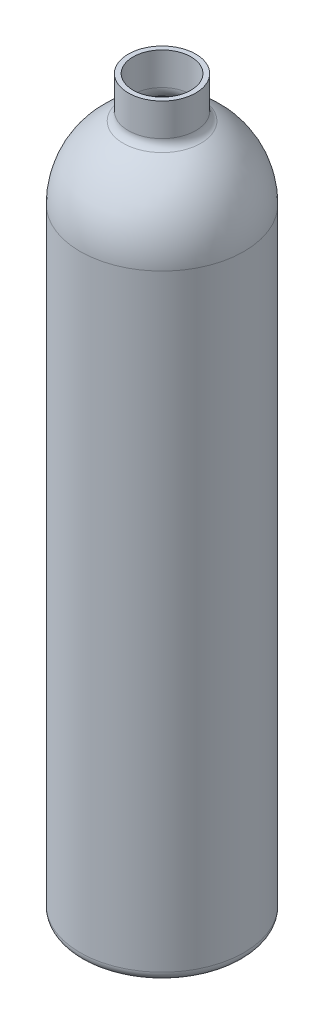
ISO-10303-21;
HEADER;
FILE_DESCRIPTION(('STEP AP214'),'2;1');
FILE_NAME('part.step','',(''),(''),'','','');
FILE_SCHEMA(('AUTOMOTIVE_DESIGN { 1 0 10303 214 1 1 1 1 }'));
ENDSEC;
DATA;
#1=APPLICATION_CONTEXT('core data for automotive mechanical design processes');
#2=APPLICATION_PROTOCOL_DEFINITION('international standard','automotive_design',2000,#1);
#3=PRODUCT_CONTEXT('',#1,'mechanical');
#4=PRODUCT('Part','Part','',(#3));
#5=PRODUCT_RELATED_PRODUCT_CATEGORY('part','',(#4));
#6=PRODUCT_DEFINITION_FORMATION('','',#4);
#7=PRODUCT_DEFINITION_CONTEXT('part definition',#1,'design');
#8=PRODUCT_DEFINITION('design','',#6,#7);
#9=PRODUCT_DEFINITION_SHAPE('','',#8);
#10=(LENGTH_UNIT() NAMED_UNIT(*) SI_UNIT(.MILLI.,.METRE.));
#11=(NAMED_UNIT(*) PLANE_ANGLE_UNIT() SI_UNIT($,.RADIAN.));
#12=(NAMED_UNIT(*) SI_UNIT($,.STERADIAN.) SOLID_ANGLE_UNIT());
#13=UNCERTAINTY_MEASURE_WITH_UNIT(LENGTH_MEASURE(1.E-05),#10,'distance_accuracy_value','');
#14=(GEOMETRIC_REPRESENTATION_CONTEXT(3) GLOBAL_UNCERTAINTY_ASSIGNED_CONTEXT((#13)) GLOBAL_UNIT_ASSIGNED_CONTEXT((#10,
#11,#12)) REPRESENTATION_CONTEXT('',''));
#15=CARTESIAN_POINT('',(0.,0.,0.));
#16=DIRECTION('',(0.,0.,1.));
#17=DIRECTION('',(1.,0.,0.));
#18=AXIS2_PLACEMENT_3D('',#15,#16,#17);
#19=CARTESIAN_POINT('',(0.,0.,0.));
#20=DIRECTION('',(0.,-1.,0.));
#21=DIRECTION('',(0.,0.,-1.));
#22=AXIS2_PLACEMENT_3D('',#19,#20,#21);
#23=PLANE('',#22);
#24=CARTESIAN_POINT('',(0.,0.,0.));
#25=DIRECTION('',(0.,-1.,0.));
#26=DIRECTION('',(0.,0.,-1.));
#27=AXIS2_PLACEMENT_3D('',#24,#25,#26);
#28=CIRCLE('',#27,23.8125);
#29=CARTESIAN_POINT('',(0.,0.,-23.8125));
#30=VERTEX_POINT('',#29);
#31=EDGE_CURVE('E10',#30,#30,#28,.T.);
#32=ORIENTED_EDGE('',*,*,#31,.T.);
#33=EDGE_LOOP('',(#32));
#34=FACE_BOUND('',#33,.T.);
#35=ADVANCED_FACE('F38',(#34),#23,.T.);
#36=CARTESIAN_POINT('',(0.,3.175,0.));
#37=DIRECTION('',(0.,-1.,0.));
#38=DIRECTION('',(0.,0.,-1.));
#39=AXIS2_PLACEMENT_3D('',#36,#37,#38);
#40=TOROIDAL_SURFACE('',#39,23.8125,3.175);
#41=CARTESIAN_POINT('',(0.,3.17500000000002,0.));
#42=DIRECTION('',(0.,-1.,0.));
#43=DIRECTION('',(0.,0.,-1.));
#44=AXIS2_PLACEMENT_3D('',#41,#42,#43);
#45=CIRCLE('',#44,26.9875);
#46=CARTESIAN_POINT('',(0.,3.17500000000002,-26.9875));
#47=VERTEX_POINT('',#46);
#48=EDGE_CURVE('E44',#47,#47,#45,.T.);
#49=ORIENTED_EDGE('',*,*,#48,.T.);
#50=EDGE_LOOP('',(#49));
#51=FACE_BOUND('',#50,.T.);
#52=ORIENTED_EDGE('',*,*,#31,.F.);
#53=EDGE_LOOP('',(#52));
#54=FACE_BOUND('',#53,.T.);
#55=ADVANCED_FACE('F99',(#51,#54),#40,.T.);
#56=CARTESIAN_POINT('',(0.,0.,0.));
#57=DIRECTION('',(0.,-1.,0.));
#58=DIRECTION('',(0.,0.,-1.));
#59=AXIS2_PLACEMENT_3D('',#56,#57,#58);
#60=CYLINDRICAL_SURFACE('',#59,26.9875);
#61=CARTESIAN_POINT('',(0.,203.2,0.));
#62=DIRECTION('',(0.,-1.,0.));
#63=DIRECTION('',(0.,0.,-1.));
#64=AXIS2_PLACEMENT_3D('',#61,#62,#63);
#65=CIRCLE('',#64,26.9875);
#66=CARTESIAN_POINT('',(0.,203.2,-26.9875));
#67=VERTEX_POINT('',#66);
#68=EDGE_CURVE('E48',#67,#67,#65,.T.);
#69=ORIENTED_EDGE('',*,*,#68,.T.);
#70=EDGE_LOOP('',(#69));
#71=FACE_BOUND('',#70,.T.);
#72=ORIENTED_EDGE('',*,*,#48,.F.);
#73=EDGE_LOOP('',(#72));
#74=FACE_BOUND('',#73,.T.);
#75=ADVANCED_FACE('F103',(#71,#74),#60,.T.);
#76=CARTESIAN_POINT('',(0.,203.2,0.));
#77=DIRECTION('',(0.,-1.,0.));
#78=DIRECTION('',(0.,0.,-1.));
#79=AXIS2_PLACEMENT_3D('',#76,#77,#78);
#80=SPHERICAL_SURFACE('',#79,26.9875);
#81=CARTESIAN_POINT('',(0.,226.967749964304,0.));
#82=DIRECTION('',(0.,-1.,0.));
#83=DIRECTION('',(0.,0.,-1.));
#84=AXIS2_PLACEMENT_3D('',#81,#82,#83);
#85=CIRCLE('',#84,12.783552631579);
#86=CARTESIAN_POINT('',(0.,226.967749964304,-12.783552631579));
#87=VERTEX_POINT('',#86);
#88=EDGE_CURVE('E52',#87,#87,#85,.T.);
#89=ORIENTED_EDGE('',*,*,#88,.T.);
#90=EDGE_LOOP('',(#89));
#91=FACE_BOUND('',#90,.T.);
#92=ORIENTED_EDGE('',*,*,#68,.F.);
#93=EDGE_LOOP('',(#92));
#94=FACE_BOUND('',#93,.T.);
#95=ADVANCED_FACE('F107',(#91,#94),#80,.T.);
#96=CARTESIAN_POINT('',(0.,229.763955842457,0.));
#97=DIRECTION('',(0.,-1.,0.));
#98=DIRECTION('',(0.,0.,-1.));
#99=AXIS2_PLACEMENT_3D('',#96,#97,#98);
#100=TOROIDAL_SURFACE('',#99,14.2875,3.175);
#101=CARTESIAN_POINT('',(0.,229.763955842457,0.));
#102=DIRECTION('',(0.,-1.,0.));
#103=DIRECTION('',(0.,0.,-1.));
#104=AXIS2_PLACEMENT_3D('',#101,#102,#103);
#105=CIRCLE('',#104,11.1125);
#106=CARTESIAN_POINT('',(0.,229.763955842457,-11.1125));
#107=VERTEX_POINT('',#106);
#108=EDGE_CURVE('E57',#107,#107,#105,.T.);
#109=ORIENTED_EDGE('',*,*,#108,.T.);
#110=EDGE_LOOP('',(#109));
#111=FACE_BOUND('',#110,.T.);
#112=ORIENTED_EDGE('',*,*,#88,.F.);
#113=EDGE_LOOP('',(#112));
#114=FACE_BOUND('',#113,.T.);
#115=ADVANCED_FACE('F114',(#111,#114),#100,.F.);
#116=CARTESIAN_POINT('',(0.,0.,0.));
#117=DIRECTION('',(0.,-1.,0.));
#118=DIRECTION('',(0.,0.,-1.));
#119=AXIS2_PLACEMENT_3D('',#116,#117,#118);
#120=CYLINDRICAL_SURFACE('',#119,11.1125);
#121=CARTESIAN_POINT('',(0.,240.493444248417,0.));
#122=DIRECTION('',(0.,-1.,0.));
#123=DIRECTION('',(0.,0.,-1.));
#124=AXIS2_PLACEMENT_3D('',#121,#122,#123);
#125=CIRCLE('',#124,11.1125);
#126=CARTESIAN_POINT('',(0.,240.493444248417,-11.1125));
#127=VERTEX_POINT('',#126);
#128=EDGE_CURVE('E60',#127,#127,#125,.T.);
#129=ORIENTED_EDGE('',*,*,#128,.T.);
#130=EDGE_LOOP('',(#129));
#131=FACE_BOUND('',#130,.T.);
#132=ORIENTED_EDGE('',*,*,#108,.F.);
#133=EDGE_LOOP('',(#132));
#134=FACE_BOUND('',#133,.T.);
#135=ADVANCED_FACE('F95',(#131,#134),#120,.T.);
#136=CARTESIAN_POINT('',(0.,240.493444248417,-11.1125));
#137=DIRECTION('',(0.,1.,0.));
#138=DIRECTION('',(0.,0.,1.));
#139=AXIS2_PLACEMENT_3D('',#136,#137,#138);
#140=PLANE('',#139);
#141=CARTESIAN_POINT('',(0.,240.493444248417,0.));
#142=DIRECTION('',(0.,1.,0.));
#143=DIRECTION('',(0.,0.,1.));
#144=AXIS2_PLACEMENT_3D('',#141,#142,#143);
#145=CIRCLE('',#144,9.525);
#146=CARTESIAN_POINT('',(0.,240.493444248417,9.525));
#147=VERTEX_POINT('',#146);
#148=EDGE_CURVE('E64',#147,#147,#145,.F.);
#149=ORIENTED_EDGE('',*,*,#148,.T.);
#150=EDGE_LOOP('',(#149));
#151=FACE_BOUND('',#150,.T.);
#152=ORIENTED_EDGE('',*,*,#128,.F.);
#153=EDGE_LOOP('',(#152));
#154=FACE_BOUND('',#153,.T.);
#155=ADVANCED_FACE('F86',(#151,#154),#140,.T.);
#156=CARTESIAN_POINT('',(0.,1.5875,0.));
#157=DIRECTION('',(0.,-1.,0.));
#158=DIRECTION('',(0.,0.,-1.));
#159=AXIS2_PLACEMENT_3D('',#156,#157,#158);
#160=PLANE('',#159);
#161=CARTESIAN_POINT('',(0.,1.5875,0.));
#162=DIRECTION('',(0.,-1.,0.));
#163=DIRECTION('',(0.,0.,-1.));
#164=AXIS2_PLACEMENT_3D('',#161,#162,#163);
#165=CIRCLE('',#164,23.8125);
#166=CARTESIAN_POINT('',(0.,1.5875,-23.8125));
#167=VERTEX_POINT('',#166);
#168=EDGE_CURVE('E63',#167,#167,#165,.T.);
#169=ORIENTED_EDGE('',*,*,#168,.F.);
#170=EDGE_LOOP('',(#169));
#171=FACE_BOUND('',#170,.T.);
#172=ADVANCED_FACE('F84',(#171),#160,.F.);
#173=CARTESIAN_POINT('',(0.,3.175,0.));
#174=DIRECTION('',(0.,-1.,0.));
#175=DIRECTION('',(0.,0.,-1.));
#176=AXIS2_PLACEMENT_3D('',#173,#174,#175);
#177=TOROIDAL_SURFACE('',#176,23.8125,1.5875);
#178=CARTESIAN_POINT('',(0.,3.17500000000001,0.));
#179=DIRECTION('',(0.,-1.,0.));
#180=DIRECTION('',(0.,0.,-1.));
#181=AXIS2_PLACEMENT_3D('',#178,#179,#180);
#182=CIRCLE('',#181,25.4);
#183=CARTESIAN_POINT('',(0.,3.17500000000001,-25.4));
#184=VERTEX_POINT('',#183);
#185=EDGE_CURVE('E76',#184,#184,#182,.T.);
#186=ORIENTED_EDGE('',*,*,#185,.F.);
#187=EDGE_LOOP('',(#186));
#188=FACE_BOUND('',#187,.T.);
#189=ORIENTED_EDGE('',*,*,#168,.T.);
#190=EDGE_LOOP('',(#189));
#191=FACE_BOUND('',#190,.T.);
#192=ADVANCED_FACE('F82',(#188,#191),#177,.F.);
#193=CARTESIAN_POINT('',(0.,0.,0.));
#194=DIRECTION('',(0.,-1.,0.));
#195=DIRECTION('',(0.,0.,-1.));
#196=AXIS2_PLACEMENT_3D('',#193,#194,#195);
#197=CYLINDRICAL_SURFACE('',#196,25.4);
#198=CARTESIAN_POINT('',(0.,203.2,0.));
#199=DIRECTION('',(0.,-1.,0.));
#200=DIRECTION('',(0.,0.,-1.));
#201=AXIS2_PLACEMENT_3D('',#198,#199,#200);
#202=CIRCLE('',#201,25.4);
#203=CARTESIAN_POINT('',(0.,203.2,-25.4));
#204=VERTEX_POINT('',#203);
#205=EDGE_CURVE('E73',#204,#204,#202,.T.);
#206=ORIENTED_EDGE('',*,*,#205,.F.);
#207=EDGE_LOOP('',(#206));
#208=FACE_BOUND('',#207,.T.);
#209=ORIENTED_EDGE('',*,*,#185,.T.);
#210=EDGE_LOOP('',(#209));
#211=FACE_BOUND('',#210,.T.);
#212=ADVANCED_FACE('F92',(#208,#211),#197,.F.);
#213=CARTESIAN_POINT('',(0.,203.2,0.));
#214=DIRECTION('',(0.,-1.,0.));
#215=DIRECTION('',(0.,0.,-1.));
#216=AXIS2_PLACEMENT_3D('',#213,#214,#215);
#217=SPHERICAL_SURFACE('',#216,25.4);
#218=CARTESIAN_POINT('',(0.,225.569647025227,0.));
#219=DIRECTION('',(0.,-1.,0.));
#220=DIRECTION('',(0.,0.,-1.));
#221=AXIS2_PLACEMENT_3D('',#218,#219,#220);
#222=CIRCLE('',#221,12.0315789473684);
#223=CARTESIAN_POINT('',(0.,225.569647025227,-12.0315789473684));
#224=VERTEX_POINT('',#223);
#225=EDGE_CURVE('E70',#224,#224,#222,.T.);
#226=ORIENTED_EDGE('',*,*,#225,.F.);
#227=EDGE_LOOP('',(#226));
#228=FACE_BOUND('',#227,.T.);
#229=ORIENTED_EDGE('',*,*,#205,.T.);
#230=EDGE_LOOP('',(#229));
#231=FACE_BOUND('',#230,.T.);
#232=ADVANCED_FACE('F129',(#228,#231),#217,.F.);
#233=CARTESIAN_POINT('',(0.,229.763955842457,0.));
#234=DIRECTION('',(0.,-1.,0.));
#235=DIRECTION('',(0.,0.,-1.));
#236=AXIS2_PLACEMENT_3D('',#233,#234,#235);
#237=TOROIDAL_SURFACE('',#236,14.2875,4.7625);
#238=CARTESIAN_POINT('',(0.,229.763955842457,0.));
#239=DIRECTION('',(0.,-1.,0.));
#240=DIRECTION('',(0.,0.,-1.));
#241=AXIS2_PLACEMENT_3D('',#238,#239,#240);
#242=CIRCLE('',#241,9.52500000000001);
#243=CARTESIAN_POINT('',(0.,229.763955842457,-9.52500000000001));
#244=VERTEX_POINT('',#243);
#245=EDGE_CURVE('E67',#244,#244,#242,.T.);
#246=ORIENTED_EDGE('',*,*,#245,.F.);
#247=EDGE_LOOP('',(#246));
#248=FACE_BOUND('',#247,.T.);
#249=ORIENTED_EDGE('',*,*,#225,.T.);
#250=EDGE_LOOP('',(#249));
#251=FACE_BOUND('',#250,.T.);
#252=ADVANCED_FACE('F125',(#248,#251),#237,.T.);
#253=CARTESIAN_POINT('',(0.,0.,0.));
#254=DIRECTION('',(0.,-1.,0.));
#255=DIRECTION('',(0.,0.,-1.));
#256=AXIS2_PLACEMENT_3D('',#253,#254,#255);
#257=CYLINDRICAL_SURFACE('',#256,9.525);
#258=ORIENTED_EDGE('',*,*,#148,.F.);
#259=EDGE_LOOP('',(#258));
#260=FACE_BOUND('',#259,.T.);
#261=ORIENTED_EDGE('',*,*,#245,.T.);
#262=EDGE_LOOP('',(#261));
#263=FACE_BOUND('',#262,.T.);
#264=ADVANCED_FACE('F122',(#260,#263),#257,.F.);
#265=CLOSED_SHELL('',(#35,#55,#75,#95,#115,#135,#155,#172,#192,#212,#232,#252,#264));
#266=MANIFOLD_SOLID_BREP('B2',#265);
#267=ADVANCED_BREP_SHAPE_REPRESENTATION('',(#18,#266),#14);
#268=SHAPE_DEFINITION_REPRESENTATION(#9,#267);
ENDSEC;
END-ISO-10303-21;
